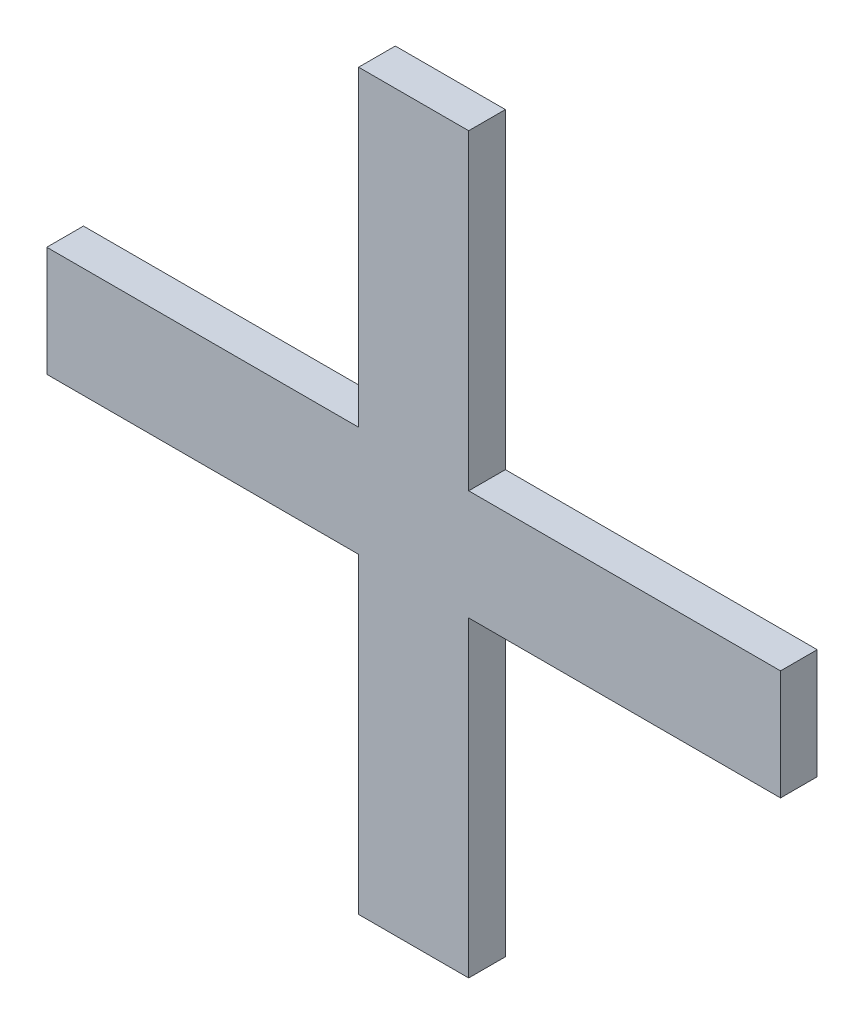
ISO-10303-21;
HEADER;
FILE_DESCRIPTION(('STEP AP214'),'2;1');
FILE_NAME('part.step','',(''),(''),'','','');
FILE_SCHEMA(('AUTOMOTIVE_DESIGN { 1 0 10303 214 1 1 1 1 }'));
ENDSEC;
DATA;
#1=APPLICATION_CONTEXT('core data for automotive mechanical design processes');
#2=APPLICATION_PROTOCOL_DEFINITION('international standard','automotive_design',2000,#1);
#3=PRODUCT_CONTEXT('',#1,'mechanical');
#4=PRODUCT('Part','Part','',(#3));
#5=PRODUCT_RELATED_PRODUCT_CATEGORY('part','',(#4));
#6=PRODUCT_DEFINITION_FORMATION('','',#4);
#7=PRODUCT_DEFINITION_CONTEXT('part definition',#1,'design');
#8=PRODUCT_DEFINITION('design','',#6,#7);
#9=PRODUCT_DEFINITION_SHAPE('','',#8);
#10=(LENGTH_UNIT() NAMED_UNIT(*) SI_UNIT(.MILLI.,.METRE.));
#11=(NAMED_UNIT(*) PLANE_ANGLE_UNIT() SI_UNIT($,.RADIAN.));
#12=(NAMED_UNIT(*) SI_UNIT($,.STERADIAN.) SOLID_ANGLE_UNIT());
#13=UNCERTAINTY_MEASURE_WITH_UNIT(LENGTH_MEASURE(1.E-05),#10,'distance_accuracy_value','');
#14=(GEOMETRIC_REPRESENTATION_CONTEXT(3) GLOBAL_UNCERTAINTY_ASSIGNED_CONTEXT((#13)) GLOBAL_UNIT_ASSIGNED_CONTEXT((#10,
#11,#12)) REPRESENTATION_CONTEXT('',''));
#15=CARTESIAN_POINT('',(0.,0.,0.));
#16=DIRECTION('',(0.,0.,1.));
#17=DIRECTION('',(1.,0.,0.));
#18=AXIS2_PLACEMENT_3D('',#15,#16,#17);
#19=CARTESIAN_POINT('',(-4925.27272727273,-769.818181818181,10.));
#20=DIRECTION('',(1.,0.,0.));
#21=DIRECTION('',(0.,0.,-1.));
#22=AXIS2_PLACEMENT_3D('',#19,#20,#21);
#23=PLANE('',#22);
#24=DIRECTION('',(0.,0.,1.));
#25=VECTOR('',#24,1.);
#26=CARTESIAN_POINT('',(-4925.27272727273,-884.818181818181,10.));
#27=LINE('',#26,#25);
#28=CARTESIAN_POINT('',(-4925.27272727273,-884.818181818181,0.));
#29=VERTEX_POINT('',#28);
#30=CARTESIAN_POINT('',(-4925.27272727273,-884.818181818181,10.));
#31=VERTEX_POINT('',#30);
#32=EDGE_CURVE('E136',#29,#31,#27,.T.);
#33=ORIENTED_EDGE('',*,*,#32,.F.);
#34=DIRECTION('',(0.,-1.,0.));
#35=VECTOR('',#34,1.);
#36=CARTESIAN_POINT('',(-4925.27272727273,-769.818181818181,0.));
#37=LINE('',#36,#35);
#38=CARTESIAN_POINT('',(-4925.27272727273,-969.818181818181,0.));
#39=VERTEX_POINT('',#38);
#40=EDGE_CURVE('E169',#29,#39,#37,.T.);
#41=ORIENTED_EDGE('',*,*,#40,.T.);
#42=DIRECTION('',(0.,0.,-1.));
#43=VECTOR('',#42,1.);
#44=CARTESIAN_POINT('',(-4925.27272727273,-969.818181818181,10.));
#45=LINE('',#44,#43);
#46=CARTESIAN_POINT('',(-4925.27272727273,-969.818181818181,10.));
#47=VERTEX_POINT('',#46);
#48=EDGE_CURVE('E11',#47,#39,#45,.T.);
#49=ORIENTED_EDGE('',*,*,#48,.F.);
#50=DIRECTION('',(0.,-1.,0.));
#51=VECTOR('',#50,1.);
#52=CARTESIAN_POINT('',(-4925.27272727273,-769.818181818181,10.));
#53=LINE('',#52,#51);
#54=EDGE_CURVE('E173',#31,#47,#53,.T.);
#55=ORIENTED_EDGE('',*,*,#54,.F.);
#56=EDGE_LOOP('',(#33,#41,#49,#55));
#57=FACE_BOUND('',#56,.T.);
#58=ADVANCED_FACE('F37',(#57),#23,.F.);
#59=DIRECTION('',(0.,0.,-1.));
#60=VECTOR('',#59,1.);
#61=CARTESIAN_POINT('',(-4925.27272727273,-854.818181818181,10.));
#62=LINE('',#61,#60);
#63=CARTESIAN_POINT('',(-4925.27272727273,-854.818181818181,10.));
#64=VERTEX_POINT('',#63);
#65=CARTESIAN_POINT('',(-4925.27272727273,-854.818181818181,0.));
#66=VERTEX_POINT('',#65);
#67=EDGE_CURVE('E158',#64,#66,#62,.T.);
#68=ORIENTED_EDGE('',*,*,#67,.F.);
#69=CARTESIAN_POINT('',(-4925.27272727273,-769.818181818181,10.));
#70=VERTEX_POINT('',#69);
#71=EDGE_CURVE('E170',#70,#64,#53,.T.);
#72=ORIENTED_EDGE('',*,*,#71,.F.);
#73=DIRECTION('',(0.,0.,-1.));
#74=VECTOR('',#73,1.);
#75=CARTESIAN_POINT('',(-4925.27272727273,-769.818181818181,10.));
#76=LINE('',#75,#74);
#77=CARTESIAN_POINT('',(-4925.27272727273,-769.818181818181,0.));
#78=VERTEX_POINT('',#77);
#79=EDGE_CURVE('E179',#70,#78,#76,.T.);
#80=ORIENTED_EDGE('',*,*,#79,.T.);
#81=EDGE_CURVE('E180',#78,#66,#37,.T.);
#82=ORIENTED_EDGE('',*,*,#81,.T.);
#83=EDGE_LOOP('',(#68,#72,#80,#82));
#84=FACE_BOUND('',#83,.T.);
#85=ADVANCED_FACE('F246',(#84),#23,.F.);
#86=CARTESIAN_POINT('',(-4895.27272727273,-769.818181818181,10.));
#87=DIRECTION('',(-1.,0.,0.));
#88=DIRECTION('',(0.,-1.,0.));
#89=AXIS2_PLACEMENT_3D('',#86,#87,#88);
#90=PLANE('',#89);
#91=DIRECTION('',(0.,0.,-1.));
#92=VECTOR('',#91,1.);
#93=CARTESIAN_POINT('',(-4895.27272727273,-884.818181818181,10.));
#94=LINE('',#93,#92);
#95=CARTESIAN_POINT('',(-4895.27272727273,-884.818181818181,10.));
#96=VERTEX_POINT('',#95);
#97=CARTESIAN_POINT('',(-4895.27272727273,-884.818181818181,0.));
#98=VERTEX_POINT('',#97);
#99=EDGE_CURVE('E59',#96,#98,#94,.T.);
#100=ORIENTED_EDGE('',*,*,#99,.F.);
#101=DIRECTION('',(0.,1.,0.));
#102=VECTOR('',#101,1.);
#103=CARTESIAN_POINT('',(-4895.27272727273,-769.818181818181,10.));
#104=LINE('',#103,#102);
#105=CARTESIAN_POINT('',(-4895.27272727273,-969.818181818181,10.));
#106=VERTEX_POINT('',#105);
#107=EDGE_CURVE('E175',#106,#96,#104,.T.);
#108=ORIENTED_EDGE('',*,*,#107,.F.);
#109=DIRECTION('',(0.,0.,-1.));
#110=VECTOR('',#109,1.);
#111=CARTESIAN_POINT('',(-4895.27272727273,-969.818181818181,10.));
#112=LINE('',#111,#110);
#113=CARTESIAN_POINT('',(-4895.27272727273,-969.818181818181,0.));
#114=VERTEX_POINT('',#113);
#115=EDGE_CURVE('E44',#106,#114,#112,.T.);
#116=ORIENTED_EDGE('',*,*,#115,.T.);
#117=DIRECTION('',(0.,1.,0.));
#118=VECTOR('',#117,1.);
#119=CARTESIAN_POINT('',(-4895.27272727273,-769.818181818181,0.));
#120=LINE('',#119,#118);
#121=EDGE_CURVE('E185',#114,#98,#120,.T.);
#122=ORIENTED_EDGE('',*,*,#121,.T.);
#123=EDGE_LOOP('',(#100,#108,#116,#122));
#124=FACE_BOUND('',#123,.T.);
#125=ADVANCED_FACE('F196',(#124),#90,.F.);
#126=DIRECTION('',(0.,0.,1.));
#127=VECTOR('',#126,1.);
#128=CARTESIAN_POINT('',(-4895.27272727273,-854.818181818181,10.));
#129=LINE('',#128,#127);
#130=CARTESIAN_POINT('',(-4895.27272727273,-854.818181818181,0.));
#131=VERTEX_POINT('',#130);
#132=CARTESIAN_POINT('',(-4895.27272727273,-854.818181818181,10.));
#133=VERTEX_POINT('',#132);
#134=EDGE_CURVE('E155',#131,#133,#129,.T.);
#135=ORIENTED_EDGE('',*,*,#134,.F.);
#136=CARTESIAN_POINT('',(-4895.27272727273,-769.818181818181,0.));
#137=VERTEX_POINT('',#136);
#138=EDGE_CURVE('E184',#131,#137,#120,.T.);
#139=ORIENTED_EDGE('',*,*,#138,.T.);
#140=DIRECTION('',(0.,0.,-1.));
#141=VECTOR('',#140,1.);
#142=CARTESIAN_POINT('',(-4895.27272727273,-769.818181818181,10.));
#143=LINE('',#142,#141);
#144=CARTESIAN_POINT('',(-4895.27272727273,-769.818181818181,10.));
#145=VERTEX_POINT('',#144);
#146=EDGE_CURVE('E191',#145,#137,#143,.T.);
#147=ORIENTED_EDGE('',*,*,#146,.F.);
#148=EDGE_CURVE('E51',#133,#145,#104,.T.);
#149=ORIENTED_EDGE('',*,*,#148,.F.);
#150=EDGE_LOOP('',(#135,#139,#147,#149));
#151=FACE_BOUND('',#150,.T.);
#152=ADVANCED_FACE('F230',(#151),#90,.F.);
#153=CARTESIAN_POINT('',(-4925.27272727273,-969.818181818181,10.));
#154=DIRECTION('',(0.,1.,0.));
#155=DIRECTION('',(-1.,0.,0.));
#156=AXIS2_PLACEMENT_3D('',#153,#154,#155);
#157=PLANE('',#156);
#158=DIRECTION('',(1.,0.,0.));
#159=VECTOR('',#158,1.);
#160=CARTESIAN_POINT('',(-4925.27272727273,-969.818181818181,0.));
#161=LINE('',#160,#159);
#162=EDGE_CURVE('E182',#39,#114,#161,.T.);
#163=ORIENTED_EDGE('',*,*,#162,.T.);
#164=ORIENTED_EDGE('',*,*,#115,.F.);
#165=DIRECTION('',(1.,0.,0.));
#166=VECTOR('',#165,1.);
#167=CARTESIAN_POINT('',(-4925.27272727273,-969.818181818181,10.));
#168=LINE('',#167,#166);
#169=EDGE_CURVE('E172',#47,#106,#168,.T.);
#170=ORIENTED_EDGE('',*,*,#169,.F.);
#171=ORIENTED_EDGE('',*,*,#48,.T.);
#172=EDGE_LOOP('',(#163,#164,#170,#171));
#173=FACE_BOUND('',#172,.T.);
#174=ADVANCED_FACE('F261',(#173),#157,.F.);
#175=CARTESIAN_POINT('',(-4925.27272727273,-769.818181818181,10.));
#176=DIRECTION('',(0.,-1.,0.));
#177=DIRECTION('',(0.,0.,-1.));
#178=AXIS2_PLACEMENT_3D('',#175,#176,#177);
#179=PLANE('',#178);
#180=DIRECTION('',(-1.,0.,0.));
#181=VECTOR('',#180,1.);
#182=CARTESIAN_POINT('',(-4925.27272727273,-769.818181818181,0.));
#183=LINE('',#182,#181);
#184=EDGE_CURVE('E187',#137,#78,#183,.T.);
#185=ORIENTED_EDGE('',*,*,#184,.T.);
#186=ORIENTED_EDGE('',*,*,#79,.F.);
#187=DIRECTION('',(-1.,0.,0.));
#188=VECTOR('',#187,1.);
#189=CARTESIAN_POINT('',(-4925.27272727273,-769.818181818181,10.));
#190=LINE('',#189,#188);
#191=EDGE_CURVE('E177',#145,#70,#190,.T.);
#192=ORIENTED_EDGE('',*,*,#191,.F.);
#193=ORIENTED_EDGE('',*,*,#146,.T.);
#194=EDGE_LOOP('',(#185,#186,#192,#193));
#195=FACE_BOUND('',#194,.T.);
#196=ADVANCED_FACE('F259',(#195),#179,.F.);
#197=CARTESIAN_POINT('',(0.,0.,10.));
#198=DIRECTION('',(0.,0.,1.));
#199=DIRECTION('',(1.,0.,0.));
#200=AXIS2_PLACEMENT_3D('',#197,#198,#199);
#201=PLANE('',#200);
#202=ORIENTED_EDGE('',*,*,#71,.T.);
#203=DIRECTION('',(-1.,0.,0.));
#204=VECTOR('',#203,1.);
#205=CARTESIAN_POINT('',(-5010.27272727273,-854.818181818181,10.));
#206=LINE('',#205,#204);
#207=CARTESIAN_POINT('',(-5010.27272727273,-854.818181818181,10.));
#208=VERTEX_POINT('',#207);
#209=EDGE_CURVE('E146',#64,#208,#206,.T.);
#210=ORIENTED_EDGE('',*,*,#209,.T.);
#211=DIRECTION('',(0.,-1.,0.));
#212=VECTOR('',#211,1.);
#213=CARTESIAN_POINT('',(-5010.27272727273,-854.818181818181,10.));
#214=LINE('',#213,#212);
#215=CARTESIAN_POINT('',(-5010.27272727273,-884.818181818181,10.));
#216=VERTEX_POINT('',#215);
#217=EDGE_CURVE('E142',#208,#216,#214,.T.);
#218=ORIENTED_EDGE('',*,*,#217,.T.);
#219=DIRECTION('',(1.,0.,0.));
#220=VECTOR('',#219,1.);
#221=CARTESIAN_POINT('',(-5010.27272727273,-884.818181818181,10.));
#222=LINE('',#221,#220);
#223=EDGE_CURVE('E128',#216,#31,#222,.T.);
#224=ORIENTED_EDGE('',*,*,#223,.T.);
#225=ORIENTED_EDGE('',*,*,#54,.T.);
#226=ORIENTED_EDGE('',*,*,#169,.T.);
#227=ORIENTED_EDGE('',*,*,#107,.T.);
#228=CARTESIAN_POINT('',(-4810.27272727273,-884.818181818181,10.));
#229=VERTEX_POINT('',#228);
#230=EDGE_CURVE('E139',#96,#229,#222,.T.);
#231=ORIENTED_EDGE('',*,*,#230,.T.);
#232=DIRECTION('',(0.,1.,0.));
#233=VECTOR('',#232,1.);
#234=CARTESIAN_POINT('',(-4810.27272727273,-854.818181818181,10.));
#235=LINE('',#234,#233);
#236=CARTESIAN_POINT('',(-4810.27272727273,-854.818181818181,10.));
#237=VERTEX_POINT('',#236);
#238=EDGE_CURVE('E138',#229,#237,#235,.T.);
#239=ORIENTED_EDGE('',*,*,#238,.T.);
#240=EDGE_CURVE('E219',#237,#133,#206,.T.);
#241=ORIENTED_EDGE('',*,*,#240,.T.);
#242=ORIENTED_EDGE('',*,*,#148,.T.);
#243=ORIENTED_EDGE('',*,*,#191,.T.);
#244=EDGE_LOOP('',(#202,#210,#218,#224,#225,#226,#227,#231,#239,#241,#242,#243));
#245=FACE_BOUND('',#244,.T.);
#246=ADVANCED_FACE('F144',(#245),#201,.T.);
#247=CARTESIAN_POINT('',(0.,0.,0.));
#248=DIRECTION('',(0.,0.,1.));
#249=DIRECTION('',(1.,0.,0.));
#250=AXIS2_PLACEMENT_3D('',#247,#248,#249);
#251=PLANE('',#250);
#252=ORIENTED_EDGE('',*,*,#138,.F.);
#253=DIRECTION('',(-1.,0.,0.));
#254=VECTOR('',#253,1.);
#255=CARTESIAN_POINT('',(-5010.27272727273,-854.818181818181,0.));
#256=LINE('',#255,#254);
#257=CARTESIAN_POINT('',(-4810.27272727273,-854.818181818181,0.));
#258=VERTEX_POINT('',#257);
#259=EDGE_CURVE('E150',#258,#131,#256,.T.);
#260=ORIENTED_EDGE('',*,*,#259,.F.);
#261=DIRECTION('',(0.,1.,0.));
#262=VECTOR('',#261,1.);
#263=CARTESIAN_POINT('',(-4810.27272727273,-854.818181818181,0.));
#264=LINE('',#263,#262);
#265=CARTESIAN_POINT('',(-4810.27272727273,-884.818181818181,0.));
#266=VERTEX_POINT('',#265);
#267=EDGE_CURVE('E206',#266,#258,#264,.T.);
#268=ORIENTED_EDGE('',*,*,#267,.F.);
#269=DIRECTION('',(1.,0.,0.));
#270=VECTOR('',#269,1.);
#271=CARTESIAN_POINT('',(-5010.27272727273,-884.818181818181,0.));
#272=LINE('',#271,#270);
#273=EDGE_CURVE('E204',#98,#266,#272,.T.);
#274=ORIENTED_EDGE('',*,*,#273,.F.);
#275=ORIENTED_EDGE('',*,*,#121,.F.);
#276=ORIENTED_EDGE('',*,*,#162,.F.);
#277=ORIENTED_EDGE('',*,*,#40,.F.);
#278=CARTESIAN_POINT('',(-5010.27272727273,-884.818181818181,0.));
#279=VERTEX_POINT('',#278);
#280=EDGE_CURVE('E209',#279,#29,#272,.T.);
#281=ORIENTED_EDGE('',*,*,#280,.F.);
#282=DIRECTION('',(0.,-1.,0.));
#283=VECTOR('',#282,1.);
#284=CARTESIAN_POINT('',(-5010.27272727273,-854.818181818181,0.));
#285=LINE('',#284,#283);
#286=CARTESIAN_POINT('',(-5010.27272727273,-854.818181818181,0.));
#287=VERTEX_POINT('',#286);
#288=EDGE_CURVE('E154',#287,#279,#285,.T.);
#289=ORIENTED_EDGE('',*,*,#288,.F.);
#290=EDGE_CURVE('E215',#66,#287,#256,.T.);
#291=ORIENTED_EDGE('',*,*,#290,.F.);
#292=ORIENTED_EDGE('',*,*,#81,.F.);
#293=ORIENTED_EDGE('',*,*,#184,.F.);
#294=EDGE_LOOP('',(#252,#260,#268,#274,#275,#276,#277,#281,#289,#291,#292,#293));
#295=FACE_BOUND('',#294,.T.);
#296=ADVANCED_FACE('F202',(#295),#251,.F.);
#297=CARTESIAN_POINT('',(-4810.27272727273,-854.818181818181,10.));
#298=DIRECTION('',(-1.,0.,0.));
#299=DIRECTION('',(0.,0.,1.));
#300=AXIS2_PLACEMENT_3D('',#297,#298,#299);
#301=PLANE('',#300);
#302=ORIENTED_EDGE('',*,*,#267,.T.);
#303=DIRECTION('',(0.,0.,-1.));
#304=VECTOR('',#303,1.);
#305=CARTESIAN_POINT('',(-4810.27272727273,-854.818181818181,10.));
#306=LINE('',#305,#304);
#307=EDGE_CURVE('E161',#237,#258,#306,.T.);
#308=ORIENTED_EDGE('',*,*,#307,.F.);
#309=ORIENTED_EDGE('',*,*,#238,.F.);
#310=DIRECTION('',(0.,0.,-1.));
#311=VECTOR('',#310,1.);
#312=CARTESIAN_POINT('',(-4810.27272727273,-884.818181818181,10.));
#313=LINE('',#312,#311);
#314=EDGE_CURVE('E156',#229,#266,#313,.T.);
#315=ORIENTED_EDGE('',*,*,#314,.T.);
#316=EDGE_LOOP('',(#302,#308,#309,#315));
#317=FACE_BOUND('',#316,.T.);
#318=ADVANCED_FACE('F233',(#317),#301,.F.);
#319=CARTESIAN_POINT('',(-5010.27272727273,-854.818181818181,10.));
#320=DIRECTION('',(0.,-1.,0.));
#321=DIRECTION('',(0.,0.,-1.));
#322=AXIS2_PLACEMENT_3D('',#319,#320,#321);
#323=PLANE('',#322);
#324=ORIENTED_EDGE('',*,*,#259,.T.);
#325=ORIENTED_EDGE('',*,*,#134,.T.);
#326=ORIENTED_EDGE('',*,*,#240,.F.);
#327=ORIENTED_EDGE('',*,*,#307,.T.);
#328=EDGE_LOOP('',(#324,#325,#326,#327));
#329=FACE_BOUND('',#328,.T.);
#330=ADVANCED_FACE('F224',(#329),#323,.F.);
#331=CARTESIAN_POINT('',(-5010.27272727273,-884.818181818181,10.));
#332=DIRECTION('',(0.,1.,0.));
#333=DIRECTION('',(-1.,0.,0.));
#334=AXIS2_PLACEMENT_3D('',#331,#332,#333);
#335=PLANE('',#334);
#336=ORIENTED_EDGE('',*,*,#230,.F.);
#337=ORIENTED_EDGE('',*,*,#99,.T.);
#338=ORIENTED_EDGE('',*,*,#273,.T.);
#339=ORIENTED_EDGE('',*,*,#314,.F.);
#340=EDGE_LOOP('',(#336,#337,#338,#339));
#341=FACE_BOUND('',#340,.T.);
#342=ADVANCED_FACE('F234',(#341),#335,.F.);
#343=ORIENTED_EDGE('',*,*,#280,.T.);
#344=ORIENTED_EDGE('',*,*,#32,.T.);
#345=ORIENTED_EDGE('',*,*,#223,.F.);
#346=DIRECTION('',(0.,0.,-1.));
#347=VECTOR('',#346,1.);
#348=CARTESIAN_POINT('',(-5010.27272727273,-884.818181818181,10.));
#349=LINE('',#348,#347);
#350=EDGE_CURVE('E133',#216,#279,#349,.T.);
#351=ORIENTED_EDGE('',*,*,#350,.T.);
#352=EDGE_LOOP('',(#343,#344,#345,#351));
#353=FACE_BOUND('',#352,.T.);
#354=ADVANCED_FACE('F131',(#353),#335,.F.);
#355=ORIENTED_EDGE('',*,*,#209,.F.);
#356=ORIENTED_EDGE('',*,*,#67,.T.);
#357=ORIENTED_EDGE('',*,*,#290,.T.);
#358=DIRECTION('',(0.,0.,-1.));
#359=VECTOR('',#358,1.);
#360=CARTESIAN_POINT('',(-5010.27272727273,-854.818181818181,10.));
#361=LINE('',#360,#359);
#362=EDGE_CURVE('E218',#208,#287,#361,.T.);
#363=ORIENTED_EDGE('',*,*,#362,.F.);
#364=EDGE_LOOP('',(#355,#356,#357,#363));
#365=FACE_BOUND('',#364,.T.);
#366=ADVANCED_FACE('F241',(#365),#323,.F.);
#367=CARTESIAN_POINT('',(-5010.27272727273,-854.818181818181,10.));
#368=DIRECTION('',(1.,0.,0.));
#369=DIRECTION('',(0.,0.,-1.));
#370=AXIS2_PLACEMENT_3D('',#367,#368,#369);
#371=PLANE('',#370);
#372=ORIENTED_EDGE('',*,*,#288,.T.);
#373=ORIENTED_EDGE('',*,*,#350,.F.);
#374=ORIENTED_EDGE('',*,*,#217,.F.);
#375=ORIENTED_EDGE('',*,*,#362,.T.);
#376=EDGE_LOOP('',(#372,#373,#374,#375));
#377=FACE_BOUND('',#376,.T.);
#378=ADVANCED_FACE('F152',(#377),#371,.F.);
#379=CLOSED_SHELL('',(#58,#85,#125,#152,#174,#196,#246,#296,#318,#330,#342,#354,#366,#378));
#380=MANIFOLD_SOLID_BREP('B2',#379);
#381=ADVANCED_BREP_SHAPE_REPRESENTATION('',(#18,#380),#14);
#382=SHAPE_DEFINITION_REPRESENTATION(#9,#381);
ENDSEC;
END-ISO-10303-21;
